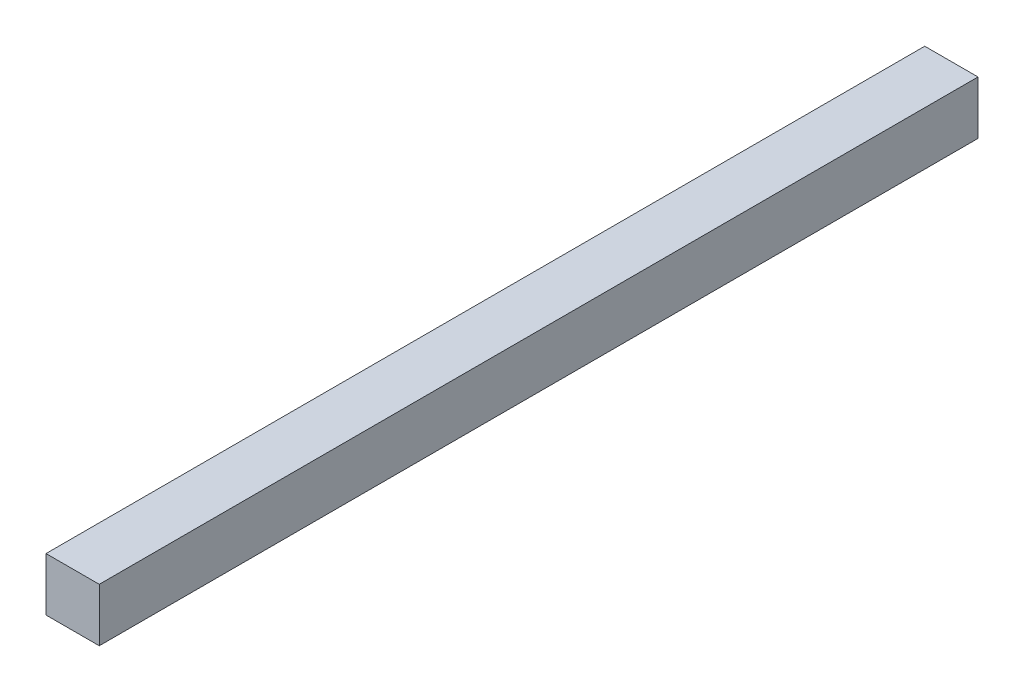
ISO-10303-21;
HEADER;
FILE_DESCRIPTION(('STEP AP214'),'2;1');
FILE_NAME('part.step','',(''),(''),'','','');
FILE_SCHEMA(('AUTOMOTIVE_DESIGN { 1 0 10303 214 1 1 1 1 }'));
ENDSEC;
DATA;
#1=APPLICATION_CONTEXT('core data for automotive mechanical design processes');
#2=APPLICATION_PROTOCOL_DEFINITION('international standard','automotive_design',2000,#1);
#3=PRODUCT_CONTEXT('',#1,'mechanical');
#4=PRODUCT('Part','Part','',(#3));
#5=PRODUCT_RELATED_PRODUCT_CATEGORY('part','',(#4));
#6=PRODUCT_DEFINITION_FORMATION('','',#4);
#7=PRODUCT_DEFINITION_CONTEXT('part definition',#1,'design');
#8=PRODUCT_DEFINITION('design','',#6,#7);
#9=PRODUCT_DEFINITION_SHAPE('','',#8);
#10=(LENGTH_UNIT() NAMED_UNIT(*) SI_UNIT(.MILLI.,.METRE.));
#11=(NAMED_UNIT(*) PLANE_ANGLE_UNIT() SI_UNIT($,.RADIAN.));
#12=(NAMED_UNIT(*) SI_UNIT($,.STERADIAN.) SOLID_ANGLE_UNIT());
#13=UNCERTAINTY_MEASURE_WITH_UNIT(LENGTH_MEASURE(1.E-05),#10,'distance_accuracy_value','');
#14=(GEOMETRIC_REPRESENTATION_CONTEXT(3) GLOBAL_UNCERTAINTY_ASSIGNED_CONTEXT((#13)) GLOBAL_UNIT_ASSIGNED_CONTEXT((#10,
#11,#12)) REPRESENTATION_CONTEXT('',''));
#15=CARTESIAN_POINT('',(0.,0.,0.));
#16=DIRECTION('',(0.,0.,1.));
#17=DIRECTION('',(1.,0.,0.));
#18=AXIS2_PLACEMENT_3D('',#15,#16,#17);
#19=CARTESIAN_POINT('',(0.,0.,330.));
#20=DIRECTION('',(-1.,0.,0.));
#21=DIRECTION('',(0.,-1.,0.));
#22=AXIS2_PLACEMENT_3D('',#19,#20,#21);
#23=PLANE('',#22);
#24=DIRECTION('',(0.,1.,0.));
#25=VECTOR('',#24,1.);
#26=CARTESIAN_POINT('',(0.,0.,0.));
#27=LINE('',#26,#25);
#28=CARTESIAN_POINT('',(0.,0.,0.));
#29=VERTEX_POINT('',#28);
#30=CARTESIAN_POINT('',(0.,20.,0.));
#31=VERTEX_POINT('',#30);
#32=EDGE_CURVE('E98',#29,#31,#27,.T.);
#33=ORIENTED_EDGE('',*,*,#32,.T.);
#34=DIRECTION('',(0.,0.,-1.));
#35=VECTOR('',#34,1.);
#36=CARTESIAN_POINT('',(0.,20.,330.));
#37=LINE('',#36,#35);
#38=CARTESIAN_POINT('',(0.,20.,330.));
#39=VERTEX_POINT('',#38);
#40=EDGE_CURVE('E11',#39,#31,#37,.T.);
#41=ORIENTED_EDGE('',*,*,#40,.F.);
#42=DIRECTION('',(0.,1.,0.));
#43=VECTOR('',#42,1.);
#44=CARTESIAN_POINT('',(0.,0.,330.));
#45=LINE('',#44,#43);
#46=CARTESIAN_POINT('',(0.,0.,330.));
#47=VERTEX_POINT('',#46);
#48=EDGE_CURVE('E86',#47,#39,#45,.T.);
#49=ORIENTED_EDGE('',*,*,#48,.F.);
#50=DIRECTION('',(0.,0.,-1.));
#51=VECTOR('',#50,1.);
#52=CARTESIAN_POINT('',(0.,0.,330.));
#53=LINE('',#52,#51);
#54=EDGE_CURVE('E94',#47,#29,#53,.T.);
#55=ORIENTED_EDGE('',*,*,#54,.T.);
#56=EDGE_LOOP('',(#33,#41,#49,#55));
#57=FACE_BOUND('',#56,.T.);
#58=ADVANCED_FACE('F35',(#57),#23,.F.);
#59=CARTESIAN_POINT('',(0.,20.,330.));
#60=DIRECTION('',(0.,-1.,0.));
#61=DIRECTION('',(1.,0.,0.));
#62=AXIS2_PLACEMENT_3D('',#59,#60,#61);
#63=PLANE('',#62);
#64=DIRECTION('',(-1.,0.,0.));
#65=VECTOR('',#64,1.);
#66=CARTESIAN_POINT('',(0.,20.,0.));
#67=LINE('',#66,#65);
#68=CARTESIAN_POINT('',(-20.,20.,0.));
#69=VERTEX_POINT('',#68);
#70=EDGE_CURVE('E90',#31,#69,#67,.T.);
#71=ORIENTED_EDGE('',*,*,#70,.T.);
#72=DIRECTION('',(0.,0.,-1.));
#73=VECTOR('',#72,1.);
#74=CARTESIAN_POINT('',(-20.,20.,330.));
#75=LINE('',#74,#73);
#76=CARTESIAN_POINT('',(-20.,20.,330.));
#77=VERTEX_POINT('',#76);
#78=EDGE_CURVE('E43',#77,#69,#75,.T.);
#79=ORIENTED_EDGE('',*,*,#78,.F.);
#80=DIRECTION('',(-1.,0.,0.));
#81=VECTOR('',#80,1.);
#82=CARTESIAN_POINT('',(0.,20.,330.));
#83=LINE('',#82,#81);
#84=EDGE_CURVE('E81',#39,#77,#83,.T.);
#85=ORIENTED_EDGE('',*,*,#84,.F.);
#86=ORIENTED_EDGE('',*,*,#40,.T.);
#87=EDGE_LOOP('',(#71,#79,#85,#86));
#88=FACE_BOUND('',#87,.T.);
#89=ADVANCED_FACE('F89',(#88),#63,.F.);
#90=CARTESIAN_POINT('',(-20.,0.,330.));
#91=DIRECTION('',(1.,0.,0.));
#92=DIRECTION('',(0.,0.,-1.));
#93=AXIS2_PLACEMENT_3D('',#90,#91,#92);
#94=PLANE('',#93);
#95=DIRECTION('',(0.,-1.,0.));
#96=VECTOR('',#95,1.);
#97=CARTESIAN_POINT('',(-20.,0.,0.));
#98=LINE('',#97,#96);
#99=CARTESIAN_POINT('',(-20.,0.,0.));
#100=VERTEX_POINT('',#99);
#101=EDGE_CURVE('E68',#69,#100,#98,.T.);
#102=ORIENTED_EDGE('',*,*,#101,.T.);
#103=DIRECTION('',(0.,0.,-1.));
#104=VECTOR('',#103,1.);
#105=CARTESIAN_POINT('',(-20.,0.,330.));
#106=LINE('',#105,#104);
#107=CARTESIAN_POINT('',(-20.,0.,330.));
#108=VERTEX_POINT('',#107);
#109=EDGE_CURVE('E91',#108,#100,#106,.T.);
#110=ORIENTED_EDGE('',*,*,#109,.F.);
#111=DIRECTION('',(0.,-1.,0.));
#112=VECTOR('',#111,1.);
#113=CARTESIAN_POINT('',(-20.,0.,330.));
#114=LINE('',#113,#112);
#115=EDGE_CURVE('E84',#77,#108,#114,.T.);
#116=ORIENTED_EDGE('',*,*,#115,.F.);
#117=ORIENTED_EDGE('',*,*,#78,.T.);
#118=EDGE_LOOP('',(#102,#110,#116,#117));
#119=FACE_BOUND('',#118,.T.);
#120=ADVANCED_FACE('F92',(#119),#94,.F.);
#121=CARTESIAN_POINT('',(0.,0.,330.));
#122=DIRECTION('',(0.,1.,0.));
#123=DIRECTION('',(0.,0.,1.));
#124=AXIS2_PLACEMENT_3D('',#121,#122,#123);
#125=PLANE('',#124);
#126=DIRECTION('',(1.,0.,0.));
#127=VECTOR('',#126,1.);
#128=CARTESIAN_POINT('',(0.,0.,0.));
#129=LINE('',#128,#127);
#130=EDGE_CURVE('E74',#100,#29,#129,.T.);
#131=ORIENTED_EDGE('',*,*,#130,.T.);
#132=ORIENTED_EDGE('',*,*,#54,.F.);
#133=DIRECTION('',(1.,0.,0.));
#134=VECTOR('',#133,1.);
#135=CARTESIAN_POINT('',(0.,0.,330.));
#136=LINE('',#135,#134);
#137=EDGE_CURVE('E51',#108,#47,#136,.T.);
#138=ORIENTED_EDGE('',*,*,#137,.F.);
#139=ORIENTED_EDGE('',*,*,#109,.T.);
#140=EDGE_LOOP('',(#131,#132,#138,#139));
#141=FACE_BOUND('',#140,.T.);
#142=ADVANCED_FACE('F105',(#141),#125,.F.);
#143=CARTESIAN_POINT('',(0.,0.,330.));
#144=DIRECTION('',(0.,0.,1.));
#145=DIRECTION('',(1.,0.,0.));
#146=AXIS2_PLACEMENT_3D('',#143,#144,#145);
#147=PLANE('',#146);
#148=ORIENTED_EDGE('',*,*,#48,.T.);
#149=ORIENTED_EDGE('',*,*,#84,.T.);
#150=ORIENTED_EDGE('',*,*,#115,.T.);
#151=ORIENTED_EDGE('',*,*,#137,.T.);
#152=EDGE_LOOP('',(#148,#149,#150,#151));
#153=FACE_BOUND('',#152,.T.);
#154=ADVANCED_FACE('F82',(#153),#147,.T.);
#155=CARTESIAN_POINT('',(0.,0.,0.));
#156=DIRECTION('',(0.,0.,1.));
#157=DIRECTION('',(1.,0.,0.));
#158=AXIS2_PLACEMENT_3D('',#155,#156,#157);
#159=PLANE('',#158);
#160=ORIENTED_EDGE('',*,*,#32,.F.);
#161=ORIENTED_EDGE('',*,*,#130,.F.);
#162=ORIENTED_EDGE('',*,*,#101,.F.);
#163=ORIENTED_EDGE('',*,*,#70,.F.);
#164=EDGE_LOOP('',(#160,#161,#162,#163));
#165=FACE_BOUND('',#164,.T.);
#166=ADVANCED_FACE('F108',(#165),#159,.F.);
#167=CLOSED_SHELL('',(#58,#89,#120,#142,#154,#166));
#168=MANIFOLD_SOLID_BREP('B2',#167);
#169=ADVANCED_BREP_SHAPE_REPRESENTATION('',(#18,#168),#14);
#170=SHAPE_DEFINITION_REPRESENTATION(#9,#169);
ENDSEC;
END-ISO-10303-21;
